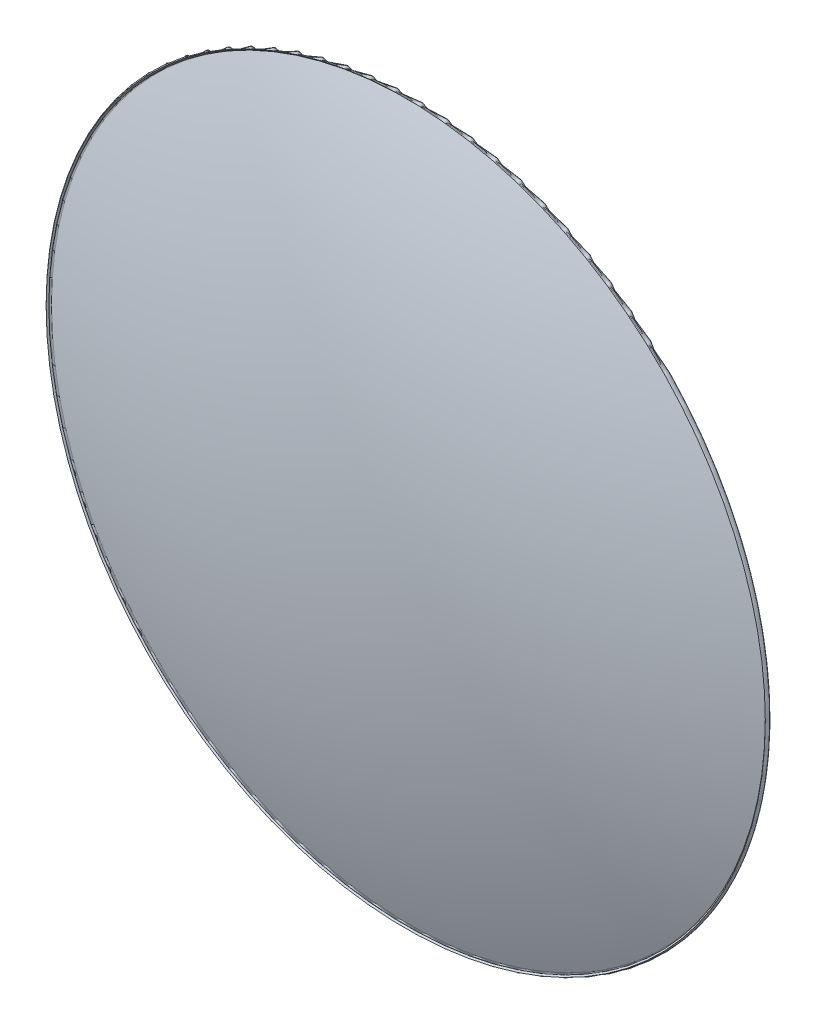
ISO-10303-21;
HEADER;
FILE_DESCRIPTION(('STEP AP214'),'2;1');
FILE_NAME('part.step','',(''),(''),'','','');
FILE_SCHEMA(('AUTOMOTIVE_DESIGN { 1 0 10303 214 1 1 1 1 }'));
ENDSEC;
DATA;
#1=APPLICATION_CONTEXT('core data for automotive mechanical design processes');
#2=APPLICATION_PROTOCOL_DEFINITION('international standard','automotive_design',2000,#1);
#3=PRODUCT_CONTEXT('',#1,'mechanical');
#4=PRODUCT('Part','Part','',(#3));
#5=PRODUCT_RELATED_PRODUCT_CATEGORY('part','',(#4));
#6=PRODUCT_DEFINITION_FORMATION('','',#4);
#7=PRODUCT_DEFINITION_CONTEXT('part definition',#1,'design');
#8=PRODUCT_DEFINITION('design','',#6,#7);
#9=PRODUCT_DEFINITION_SHAPE('','',#8);
#10=(LENGTH_UNIT() NAMED_UNIT(*) SI_UNIT(.MILLI.,.METRE.));
#11=(NAMED_UNIT(*) PLANE_ANGLE_UNIT() SI_UNIT($,.RADIAN.));
#12=(NAMED_UNIT(*) SI_UNIT($,.STERADIAN.) SOLID_ANGLE_UNIT());
#13=UNCERTAINTY_MEASURE_WITH_UNIT(LENGTH_MEASURE(1.E-05),#10,'distance_accuracy_value','');
#14=(GEOMETRIC_REPRESENTATION_CONTEXT(3) GLOBAL_UNCERTAINTY_ASSIGNED_CONTEXT((#13)) GLOBAL_UNIT_ASSIGNED_CONTEXT((#10,
#11,#12)) REPRESENTATION_CONTEXT('',''));
#15=CARTESIAN_POINT('',(0.,0.,0.));
#16=DIRECTION('',(0.,0.,1.));
#17=DIRECTION('',(1.,0.,0.));
#18=AXIS2_PLACEMENT_3D('',#15,#16,#17);
#19=CARTESIAN_POINT('',(0.,0.,1010.19103294234));
#20=DIRECTION('',(0.,0.,-1.));
#21=DIRECTION('',(-1.,0.,0.));
#22=AXIS2_PLACEMENT_3D('',#19,#20,#21);
#23=TOROIDAL_SURFACE('',#22,383.090938008823,1.07665733438003);
#24=CARTESIAN_POINT('',(0.,0.,1011.18703859049));
#25=DIRECTION('',(0.,0.,-1.));
#26=DIRECTION('',(-1.,0.,0.));
#27=AXIS2_PLACEMENT_3D('',#24,#25,#26);
#28=CIRCLE('',#27,383.499794664053);
#29=CARTESIAN_POINT('',(-383.499794664053,0.,1011.18703859049));
#30=VERTEX_POINT('',#29);
#31=EDGE_CURVE('E47',#30,#30,#28,.T.);
#32=ORIENTED_EDGE('',*,*,#31,.F.);
#33=EDGE_LOOP('',(#32));
#34=FACE_BOUND('',#33,.T.);
#35=CARTESIAN_POINT('',(0.,0.,1009.18433292163));
#36=DIRECTION('',(0.,0.,-1.));
#37=DIRECTION('',(-1.,0.,0.));
#38=AXIS2_PLACEMENT_3D('',#35,#36,#37);
#39=CIRCLE('',#38,382.709170954225);
#40=CARTESIAN_POINT('',(-382.709170954225,0.,1009.18433292163));
#41=VERTEX_POINT('',#40);
#42=EDGE_CURVE('E10',#41,#41,#39,.T.);
#43=ORIENTED_EDGE('',*,*,#42,.T.);
#44=EDGE_LOOP('',(#43));
#45=FACE_BOUND('',#44,.T.);
#46=ADVANCED_FACE('F33',(#34,#45),#23,.F.);
#47=CARTESIAN_POINT('',(0.,0.,0.));
#48=DIRECTION('',(0.,0.,-1.));
#49=DIRECTION('',(0.,1.,0.));
#50=AXIS2_PLACEMENT_3D('',#47,#48,#49);
#51=SPHERICAL_SURFACE('',#50,1079.31428571428);
#52=ORIENTED_EDGE('',*,*,#42,.F.);
#53=EDGE_LOOP('',(#52));
#54=FACE_BOUND('',#53,.T.);
#55=ADVANCED_FACE('F56',(#54),#51,.T.);
#56=CARTESIAN_POINT('',(0.,0.,0.));
#57=DIRECTION('',(0.,0.,-1.));
#58=DIRECTION('',(0.,-1.,0.));
#59=AXIS2_PLACEMENT_3D('',#56,#57,#58);
#60=SPHERICAL_SURFACE('',#59,1077.31428571428);
#61=CARTESIAN_POINT('',(0.,0.,1007.31428571428));
#62=DIRECTION('',(0.,0.,-1.));
#63=DIRECTION('',(-1.,0.,0.));
#64=AXIS2_PLACEMENT_3D('',#61,#62,#63);
#65=CIRCLE('',#64,381.999999999999);
#66=CARTESIAN_POINT('',(-381.999999999999,0.,1007.31428571428));
#67=VERTEX_POINT('',#66);
#68=EDGE_CURVE('E39',#67,#67,#65,.T.);
#69=ORIENTED_EDGE('',*,*,#68,.T.);
#70=EDGE_LOOP('',(#69));
#71=FACE_BOUND('',#70,.T.);
#72=ADVANCED_FACE('F60',(#71),#60,.F.);
#73=CARTESIAN_POINT('',(0.,0.,1010.19103294234));
#74=DIRECTION('',(0.,0.,-1.));
#75=DIRECTION('',(-1.,0.,0.));
#76=AXIS2_PLACEMENT_3D('',#73,#74,#75);
#77=TOROIDAL_SURFACE('',#76,383.090938008823,3.07665733438019);
#78=ORIENTED_EDGE('',*,*,#68,.F.);
#79=EDGE_LOOP('',(#78));
#80=FACE_BOUND('',#79,.T.);
#81=CARTESIAN_POINT('',(0.,0.,1012.62256252406));
#82=DIRECTION('',(0.,0.,-1.));
#83=DIRECTION('',(-1.,0.,0.));
#84=AXIS2_PLACEMENT_3D('',#81,#82,#83);
#85=CIRCLE('',#84,384.976006773188);
#86=CARTESIAN_POINT('',(-384.976006773188,0.,1012.62256252406));
#87=VERTEX_POINT('',#86);
#88=EDGE_CURVE('E43',#87,#87,#85,.T.);
#89=ORIENTED_EDGE('',*,*,#88,.T.);
#90=EDGE_LOOP('',(#89));
#91=FACE_BOUND('',#90,.T.);
#92=ADVANCED_FACE('F65',(#80,#91),#77,.T.);
#93=CARTESIAN_POINT('',(0.,0.,1011.18703859049));
#94=DIRECTION('',(0.,0.,1.));
#95=DIRECTION('',(1.,0.,0.));
#96=AXIS2_PLACEMENT_3D('',#93,#94,#95);
#97=CONICAL_SURFACE('',#96,383.499794664053,0.799371108368598);
#98=ORIENTED_EDGE('',*,*,#88,.F.);
#99=EDGE_LOOP('',(#98));
#100=FACE_BOUND('',#99,.T.);
#101=ORIENTED_EDGE('',*,*,#31,.T.);
#102=EDGE_LOOP('',(#101));
#103=FACE_BOUND('',#102,.T.);
#104=ADVANCED_FACE('F53',(#100,#103),#97,.F.);
#105=CLOSED_SHELL('',(#46,#55,#72,#92,#104));
#106=MANIFOLD_SOLID_BREP('B2',#105);
#107=ADVANCED_BREP_SHAPE_REPRESENTATION('',(#18,#106),#14);
#108=SHAPE_DEFINITION_REPRESENTATION(#9,#107);
ENDSEC;
END-ISO-10303-21;
